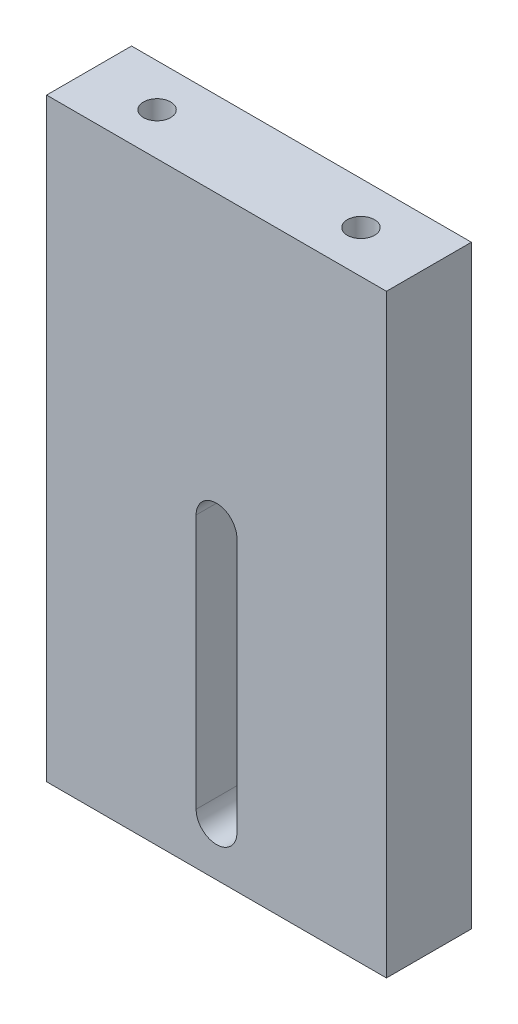
ISO-10303-21;
HEADER;
FILE_DESCRIPTION(('STEP AP214'),'2;1');
FILE_NAME('part.step','',(''),(''),'','','');
FILE_SCHEMA(('AUTOMOTIVE_DESIGN { 1 0 10303 214 1 1 1 1 }'));
ENDSEC;
DATA;
#1=APPLICATION_CONTEXT('core data for automotive mechanical design processes');
#2=APPLICATION_PROTOCOL_DEFINITION('international standard','automotive_design',2000,#1);
#3=PRODUCT_CONTEXT('',#1,'mechanical');
#4=PRODUCT('Part','Part','',(#3));
#5=PRODUCT_RELATED_PRODUCT_CATEGORY('part','',(#4));
#6=PRODUCT_DEFINITION_FORMATION('','',#4);
#7=PRODUCT_DEFINITION_CONTEXT('part definition',#1,'design');
#8=PRODUCT_DEFINITION('design','',#6,#7);
#9=PRODUCT_DEFINITION_SHAPE('','',#8);
#10=(LENGTH_UNIT() NAMED_UNIT(*) SI_UNIT(.MILLI.,.METRE.));
#11=(NAMED_UNIT(*) PLANE_ANGLE_UNIT() SI_UNIT($,.RADIAN.));
#12=(NAMED_UNIT(*) SI_UNIT($,.STERADIAN.) SOLID_ANGLE_UNIT());
#13=UNCERTAINTY_MEASURE_WITH_UNIT(LENGTH_MEASURE(1.E-05),#10,'distance_accuracy_value','');
#14=(GEOMETRIC_REPRESENTATION_CONTEXT(3) GLOBAL_UNCERTAINTY_ASSIGNED_CONTEXT((#13)) GLOBAL_UNIT_ASSIGNED_CONTEXT((#10,
#11,#12)) REPRESENTATION_CONTEXT('',''));
#15=CARTESIAN_POINT('',(0.,0.,0.));
#16=DIRECTION('',(0.,0.,1.));
#17=DIRECTION('',(1.,0.,0.));
#18=AXIS2_PLACEMENT_3D('',#15,#16,#17);
#19=CARTESIAN_POINT('',(10.,17.5,2.5));
#20=DIRECTION('',(-1.,0.,0.));
#21=DIRECTION('',(0.,-1.,0.));
#22=AXIS2_PLACEMENT_3D('',#19,#20,#21);
#23=PLANE('',#22);
#24=DIRECTION('',(0.,1.,0.));
#25=VECTOR('',#24,1.);
#26=CARTESIAN_POINT('',(10.,17.5,-2.5));
#27=LINE('',#26,#25);
#28=CARTESIAN_POINT('',(10.,-17.5,-2.5));
#29=VERTEX_POINT('',#28);
#30=CARTESIAN_POINT('',(10.,17.5,-2.5));
#31=VERTEX_POINT('',#30);
#32=EDGE_CURVE('E134',#29,#31,#27,.T.);
#33=ORIENTED_EDGE('',*,*,#32,.T.);
#34=DIRECTION('',(0.,0.,-1.));
#35=VECTOR('',#34,1.);
#36=CARTESIAN_POINT('',(10.,17.5,2.5));
#37=LINE('',#36,#35);
#38=CARTESIAN_POINT('',(10.,17.5,2.5));
#39=VERTEX_POINT('',#38);
#40=EDGE_CURVE('E11',#39,#31,#37,.T.);
#41=ORIENTED_EDGE('',*,*,#40,.F.);
#42=DIRECTION('',(0.,1.,0.));
#43=VECTOR('',#42,1.);
#44=CARTESIAN_POINT('',(10.,17.5,2.5));
#45=LINE('',#44,#43);
#46=CARTESIAN_POINT('',(10.,-17.5,2.5));
#47=VERTEX_POINT('',#46);
#48=EDGE_CURVE('E135',#47,#39,#45,.T.);
#49=ORIENTED_EDGE('',*,*,#48,.F.);
#50=DIRECTION('',(0.,0.,-1.));
#51=VECTOR('',#50,1.);
#52=CARTESIAN_POINT('',(10.,-17.5,2.5));
#53=LINE('',#52,#51);
#54=EDGE_CURVE('E145',#47,#29,#53,.T.);
#55=ORIENTED_EDGE('',*,*,#54,.T.);
#56=EDGE_LOOP('',(#33,#41,#49,#55));
#57=FACE_BOUND('',#56,.T.);
#58=ADVANCED_FACE('F17',(#57),#23,.F.);
#59=CARTESIAN_POINT('',(-10.,17.5,2.5));
#60=DIRECTION('',(0.,-1.,0.));
#61=DIRECTION('',(0.,0.,-1.));
#62=AXIS2_PLACEMENT_3D('',#59,#60,#61);
#63=PLANE('',#62);
#64=CARTESIAN_POINT('',(-6.,17.5,0.));
#65=DIRECTION('',(0.,1.,0.));
#66=DIRECTION('',(0.,0.,1.));
#67=AXIS2_PLACEMENT_3D('',#64,#65,#66);
#68=CIRCLE('',#67,0.79999999999999);
#69=CARTESIAN_POINT('',(-6.,17.5,0.79999999999999));
#70=VERTEX_POINT('',#69);
#71=EDGE_CURVE('E95',#70,#70,#68,.T.);
#72=ORIENTED_EDGE('',*,*,#71,.F.);
#73=EDGE_LOOP('',(#72));
#74=FACE_BOUND('',#73,.T.);
#75=CARTESIAN_POINT('',(6.,17.5,0.));
#76=DIRECTION('',(0.,1.,0.));
#77=DIRECTION('',(0.,0.,1.));
#78=AXIS2_PLACEMENT_3D('',#75,#76,#77);
#79=CIRCLE('',#78,0.79999999999999);
#80=CARTESIAN_POINT('',(6.,17.5,0.79999999999999));
#81=VERTEX_POINT('',#80);
#82=EDGE_CURVE('E128',#81,#81,#79,.T.);
#83=ORIENTED_EDGE('',*,*,#82,.F.);
#84=EDGE_LOOP('',(#83));
#85=FACE_BOUND('',#84,.T.);
#86=DIRECTION('',(-1.,0.,0.));
#87=VECTOR('',#86,1.);
#88=CARTESIAN_POINT('',(-10.,17.5,-2.5));
#89=LINE('',#88,#87);
#90=CARTESIAN_POINT('',(-10.,17.5,-2.5));
#91=VERTEX_POINT('',#90);
#92=EDGE_CURVE('E148',#31,#91,#89,.T.);
#93=ORIENTED_EDGE('',*,*,#92,.T.);
#94=DIRECTION('',(0.,0.,-1.));
#95=VECTOR('',#94,1.);
#96=CARTESIAN_POINT('',(-10.,17.5,2.5));
#97=LINE('',#96,#95);
#98=CARTESIAN_POINT('',(-10.,17.5,2.5));
#99=VERTEX_POINT('',#98);
#100=EDGE_CURVE('E24',#99,#91,#97,.T.);
#101=ORIENTED_EDGE('',*,*,#100,.F.);
#102=DIRECTION('',(-1.,0.,0.));
#103=VECTOR('',#102,1.);
#104=CARTESIAN_POINT('',(-10.,17.5,2.5));
#105=LINE('',#104,#103);
#106=EDGE_CURVE('E138',#39,#99,#105,.T.);
#107=ORIENTED_EDGE('',*,*,#106,.F.);
#108=ORIENTED_EDGE('',*,*,#40,.T.);
#109=EDGE_LOOP('',(#93,#101,#107,#108));
#110=FACE_BOUND('',#109,.T.);
#111=ADVANCED_FACE('F176',(#74,#85,#110),#63,.F.);
#112=CARTESIAN_POINT('',(-10.,17.5,2.5));
#113=DIRECTION('',(1.,0.,0.));
#114=DIRECTION('',(0.,1.,0.));
#115=AXIS2_PLACEMENT_3D('',#112,#113,#114);
#116=PLANE('',#115);
#117=DIRECTION('',(0.,-1.,0.));
#118=VECTOR('',#117,1.);
#119=CARTESIAN_POINT('',(-10.,17.5,-2.5));
#120=LINE('',#119,#118);
#121=CARTESIAN_POINT('',(-10.,-17.5,-2.5));
#122=VERTEX_POINT('',#121);
#123=EDGE_CURVE('E150',#91,#122,#120,.T.);
#124=ORIENTED_EDGE('',*,*,#123,.T.);
#125=DIRECTION('',(0.,0.,-1.));
#126=VECTOR('',#125,1.);
#127=CARTESIAN_POINT('',(-10.,-17.5,2.5));
#128=LINE('',#127,#126);
#129=CARTESIAN_POINT('',(-10.,-17.5,2.5));
#130=VERTEX_POINT('',#129);
#131=EDGE_CURVE('E155',#130,#122,#128,.T.);
#132=ORIENTED_EDGE('',*,*,#131,.F.);
#133=DIRECTION('',(0.,-1.,0.));
#134=VECTOR('',#133,1.);
#135=CARTESIAN_POINT('',(-10.,17.5,2.5));
#136=LINE('',#135,#134);
#137=EDGE_CURVE('E141',#99,#130,#136,.T.);
#138=ORIENTED_EDGE('',*,*,#137,.F.);
#139=ORIENTED_EDGE('',*,*,#100,.T.);
#140=EDGE_LOOP('',(#124,#132,#138,#139));
#141=FACE_BOUND('',#140,.T.);
#142=ADVANCED_FACE('F162',(#141),#116,.F.);
#143=CARTESIAN_POINT('',(-10.,-17.5,2.5));
#144=DIRECTION('',(0.,1.,0.));
#145=DIRECTION('',(0.,0.,1.));
#146=AXIS2_PLACEMENT_3D('',#143,#144,#145);
#147=PLANE('',#146);
#148=DIRECTION('',(1.,0.,0.));
#149=VECTOR('',#148,1.);
#150=CARTESIAN_POINT('',(-10.,-17.5,-2.5));
#151=LINE('',#150,#149);
#152=EDGE_CURVE('E139',#122,#29,#151,.T.);
#153=ORIENTED_EDGE('',*,*,#152,.T.);
#154=ORIENTED_EDGE('',*,*,#54,.F.);
#155=DIRECTION('',(1.,0.,0.));
#156=VECTOR('',#155,1.);
#157=CARTESIAN_POINT('',(-10.,-17.5,2.5));
#158=LINE('',#157,#156);
#159=EDGE_CURVE('E143',#130,#47,#158,.T.);
#160=ORIENTED_EDGE('',*,*,#159,.F.);
#161=ORIENTED_EDGE('',*,*,#131,.T.);
#162=EDGE_LOOP('',(#153,#154,#160,#161));
#163=FACE_BOUND('',#162,.T.);
#164=ADVANCED_FACE('F171',(#163),#147,.F.);
#165=CARTESIAN_POINT('',(0.,0.,2.5));
#166=DIRECTION('',(0.,0.,1.));
#167=DIRECTION('',(1.,0.,0.));
#168=AXIS2_PLACEMENT_3D('',#165,#166,#167);
#169=PLANE('',#168);
#170=CARTESIAN_POINT('',(0.,0.5,2.5));
#171=DIRECTION('',(0.,0.,1.));
#172=DIRECTION('',(1.,0.,0.));
#173=AXIS2_PLACEMENT_3D('',#170,#171,#172);
#174=CIRCLE('',#173,1.2);
#175=CARTESIAN_POINT('',(1.20000000000006,0.5,2.5));
#176=VERTEX_POINT('',#175);
#177=CARTESIAN_POINT('',(-1.2,0.5,2.5));
#178=VERTEX_POINT('',#177);
#179=EDGE_CURVE('E100',#176,#178,#174,.T.);
#180=ORIENTED_EDGE('',*,*,#179,.F.);
#181=DIRECTION('',(0.,1.,0.));
#182=VECTOR('',#181,1.);
#183=CARTESIAN_POINT('',(1.20000000000006,-14.5,2.5));
#184=LINE('',#183,#182);
#185=CARTESIAN_POINT('',(1.2,-14.5,2.5));
#186=VERTEX_POINT('',#185);
#187=EDGE_CURVE('E226',#186,#176,#184,.T.);
#188=ORIENTED_EDGE('',*,*,#187,.F.);
#189=CARTESIAN_POINT('',(0.,-14.5,2.5));
#190=DIRECTION('',(0.,0.,1.));
#191=DIRECTION('',(1.,0.,0.));
#192=AXIS2_PLACEMENT_3D('',#189,#190,#191);
#193=CIRCLE('',#192,1.2);
#194=CARTESIAN_POINT('',(-1.2,-14.5,2.5));
#195=VERTEX_POINT('',#194);
#196=EDGE_CURVE('E109',#195,#186,#193,.T.);
#197=ORIENTED_EDGE('',*,*,#196,.F.);
#198=DIRECTION('',(0.,1.,0.));
#199=VECTOR('',#198,1.);
#200=CARTESIAN_POINT('',(-1.2,-14.5,2.5));
#201=LINE('',#200,#199);
#202=EDGE_CURVE('E89',#195,#178,#201,.T.);
#203=ORIENTED_EDGE('',*,*,#202,.T.);
#204=EDGE_LOOP('',(#180,#188,#197,#203));
#205=FACE_BOUND('',#204,.T.);
#206=ORIENTED_EDGE('',*,*,#48,.T.);
#207=ORIENTED_EDGE('',*,*,#106,.T.);
#208=ORIENTED_EDGE('',*,*,#137,.T.);
#209=ORIENTED_EDGE('',*,*,#159,.T.);
#210=EDGE_LOOP('',(#206,#207,#208,#209));
#211=FACE_BOUND('',#210,.T.);
#212=ADVANCED_FACE('F107',(#205,#211),#169,.T.);
#213=CARTESIAN_POINT('',(0.,0.,-2.5));
#214=DIRECTION('',(0.,0.,1.));
#215=DIRECTION('',(1.,0.,0.));
#216=AXIS2_PLACEMENT_3D('',#213,#214,#215);
#217=PLANE('',#216);
#218=DIRECTION('',(0.,1.,0.));
#219=VECTOR('',#218,1.);
#220=CARTESIAN_POINT('',(1.2,-14.5,-2.5));
#221=LINE('',#220,#219);
#222=CARTESIAN_POINT('',(1.2,-14.5,-2.5));
#223=VERTEX_POINT('',#222);
#224=CARTESIAN_POINT('',(1.2,0.5,-2.5));
#225=VERTEX_POINT('',#224);
#226=EDGE_CURVE('E112',#223,#225,#221,.T.);
#227=ORIENTED_EDGE('',*,*,#226,.T.);
#228=CARTESIAN_POINT('',(0.,0.5,-2.5));
#229=DIRECTION('',(0.,0.,1.));
#230=DIRECTION('',(1.,0.,0.));
#231=AXIS2_PLACEMENT_3D('',#228,#229,#230);
#232=CIRCLE('',#231,1.2);
#233=CARTESIAN_POINT('',(-1.2,0.5,-2.5));
#234=VERTEX_POINT('',#233);
#235=EDGE_CURVE('E96',#225,#234,#232,.T.);
#236=ORIENTED_EDGE('',*,*,#235,.T.);
#237=DIRECTION('',(0.,1.,0.));
#238=VECTOR('',#237,1.);
#239=CARTESIAN_POINT('',(-1.2,-14.5,-2.5));
#240=LINE('',#239,#238);
#241=CARTESIAN_POINT('',(-1.2,-14.5,-2.5));
#242=VERTEX_POINT('',#241);
#243=EDGE_CURVE('E92',#242,#234,#240,.T.);
#244=ORIENTED_EDGE('',*,*,#243,.F.);
#245=CARTESIAN_POINT('',(0.,-14.5,-2.5));
#246=DIRECTION('',(0.,0.,1.));
#247=DIRECTION('',(1.,0.,0.));
#248=AXIS2_PLACEMENT_3D('',#245,#246,#247);
#249=CIRCLE('',#248,1.2);
#250=EDGE_CURVE('E117',#242,#223,#249,.T.);
#251=ORIENTED_EDGE('',*,*,#250,.T.);
#252=EDGE_LOOP('',(#227,#236,#244,#251));
#253=FACE_BOUND('',#252,.T.);
#254=ORIENTED_EDGE('',*,*,#32,.F.);
#255=ORIENTED_EDGE('',*,*,#152,.F.);
#256=ORIENTED_EDGE('',*,*,#123,.F.);
#257=ORIENTED_EDGE('',*,*,#92,.F.);
#258=EDGE_LOOP('',(#254,#255,#256,#257));
#259=FACE_BOUND('',#258,.T.);
#260=ADVANCED_FACE('F168',(#253,#259),#217,.F.);
#261=CARTESIAN_POINT('',(6.,12.3,0.));
#262=DIRECTION('',(0.,1.,0.));
#263=DIRECTION('',(0.,0.,1.));
#264=AXIS2_PLACEMENT_3D('',#261,#262,#263);
#265=CONICAL_SURFACE('',#264,0.8,1.02974425867665);
#266=CARTESIAN_POINT('',(6.,11.8193115047779,0.));
#267=VERTEX_POINT('',#266);
#268=VERTEX_LOOP('',#267);
#269=FACE_BOUND('',#268,.T.);
#270=CARTESIAN_POINT('',(6.,12.3,0.));
#271=DIRECTION('',(0.,1.,0.));
#272=DIRECTION('',(0.,0.,1.));
#273=AXIS2_PLACEMENT_3D('',#270,#271,#272);
#274=CIRCLE('',#273,0.8);
#275=CARTESIAN_POINT('',(6.,12.3,0.8));
#276=VERTEX_POINT('',#275);
#277=EDGE_CURVE('E131',#276,#276,#274,.T.);
#278=ORIENTED_EDGE('',*,*,#277,.T.);
#279=EDGE_LOOP('',(#278));
#280=FACE_BOUND('',#279,.T.);
#281=ADVANCED_FACE('F193',(#269,#280),#265,.F.);
#282=CARTESIAN_POINT('',(6.,17.5,0.));
#283=DIRECTION('',(0.,1.,0.));
#284=DIRECTION('',(0.,0.,1.));
#285=AXIS2_PLACEMENT_3D('',#282,#283,#284);
#286=CYLINDRICAL_SURFACE('',#285,0.8);
#287=ORIENTED_EDGE('',*,*,#277,.F.);
#288=EDGE_LOOP('',(#287));
#289=FACE_BOUND('',#288,.T.);
#290=ORIENTED_EDGE('',*,*,#82,.T.);
#291=EDGE_LOOP('',(#290));
#292=FACE_BOUND('',#291,.T.);
#293=ADVANCED_FACE('F199',(#289,#292),#286,.F.);
#294=CARTESIAN_POINT('',(-6.,12.3,0.));
#295=DIRECTION('',(0.,1.,0.));
#296=DIRECTION('',(0.,0.,1.));
#297=AXIS2_PLACEMENT_3D('',#294,#295,#296);
#298=CONICAL_SURFACE('',#297,0.8,1.02974425867665);
#299=CARTESIAN_POINT('',(-6.,11.8193115047779,0.));
#300=VERTEX_POINT('',#299);
#301=VERTEX_LOOP('',#300);
#302=FACE_BOUND('',#301,.T.);
#303=CARTESIAN_POINT('',(-6.,12.3,0.));
#304=DIRECTION('',(0.,1.,0.));
#305=DIRECTION('',(0.,0.,1.));
#306=AXIS2_PLACEMENT_3D('',#303,#304,#305);
#307=CIRCLE('',#306,0.8);
#308=CARTESIAN_POINT('',(-6.,12.3,0.8));
#309=VERTEX_POINT('',#308);
#310=EDGE_CURVE('E125',#309,#309,#307,.T.);
#311=ORIENTED_EDGE('',*,*,#310,.T.);
#312=EDGE_LOOP('',(#311));
#313=FACE_BOUND('',#312,.T.);
#314=ADVANCED_FACE('F203',(#302,#313),#298,.F.);
#315=CARTESIAN_POINT('',(-6.,17.5,0.));
#316=DIRECTION('',(0.,1.,0.));
#317=DIRECTION('',(0.,0.,1.));
#318=AXIS2_PLACEMENT_3D('',#315,#316,#317);
#319=CYLINDRICAL_SURFACE('',#318,0.8);
#320=ORIENTED_EDGE('',*,*,#310,.F.);
#321=EDGE_LOOP('',(#320));
#322=FACE_BOUND('',#321,.T.);
#323=ORIENTED_EDGE('',*,*,#71,.T.);
#324=EDGE_LOOP('',(#323));
#325=FACE_BOUND('',#324,.T.);
#326=ADVANCED_FACE('F207',(#322,#325),#319,.F.);
#327=CARTESIAN_POINT('',(0.,0.5,2.5));
#328=DIRECTION('',(0.,0.,1.));
#329=DIRECTION('',(1.,0.,0.));
#330=AXIS2_PLACEMENT_3D('',#327,#328,#329);
#331=CYLINDRICAL_SURFACE('',#330,1.2);
#332=ORIENTED_EDGE('',*,*,#235,.F.);
#333=DIRECTION('',(0.,0.,-1.));
#334=VECTOR('',#333,1.);
#335=CARTESIAN_POINT('',(1.2,0.5,-2.5));
#336=LINE('',#335,#334);
#337=EDGE_CURVE('E103',#176,#225,#336,.T.);
#338=ORIENTED_EDGE('',*,*,#337,.F.);
#339=ORIENTED_EDGE('',*,*,#179,.T.);
#340=DIRECTION('',(0.,0.,1.));
#341=VECTOR('',#340,1.);
#342=CARTESIAN_POINT('',(-1.2,0.5,2.5));
#343=LINE('',#342,#341);
#344=EDGE_CURVE('E85',#234,#178,#343,.T.);
#345=ORIENTED_EDGE('',*,*,#344,.F.);
#346=EDGE_LOOP('',(#332,#338,#339,#345));
#347=FACE_BOUND('',#346,.T.);
#348=ADVANCED_FACE('F101',(#347),#331,.F.);
#349=CARTESIAN_POINT('',(0.,-14.5,2.5));
#350=DIRECTION('',(0.,0.,1.));
#351=DIRECTION('',(1.,0.,0.));
#352=AXIS2_PLACEMENT_3D('',#349,#350,#351);
#353=CYLINDRICAL_SURFACE('',#352,1.2);
#354=ORIENTED_EDGE('',*,*,#196,.T.);
#355=DIRECTION('',(0.,0.,-1.));
#356=VECTOR('',#355,1.);
#357=CARTESIAN_POINT('',(1.2,-14.5,-2.5));
#358=LINE('',#357,#356);
#359=EDGE_CURVE('E36',#186,#223,#358,.T.);
#360=ORIENTED_EDGE('',*,*,#359,.T.);
#361=ORIENTED_EDGE('',*,*,#250,.F.);
#362=DIRECTION('',(0.,0.,1.));
#363=VECTOR('',#362,1.);
#364=CARTESIAN_POINT('',(-1.2,-14.5,2.5));
#365=LINE('',#364,#363);
#366=EDGE_CURVE('E31',#195,#242,#365,.F.);
#367=ORIENTED_EDGE('',*,*,#366,.F.);
#368=EDGE_LOOP('',(#354,#360,#361,#367));
#369=FACE_BOUND('',#368,.T.);
#370=ADVANCED_FACE('F214',(#369),#353,.F.);
#371=CARTESIAN_POINT('',(-1.2,-14.5,2.5));
#372=DIRECTION('',(-1.,0.,0.));
#373=DIRECTION('',(0.,-1.,0.));
#374=AXIS2_PLACEMENT_3D('',#371,#372,#373);
#375=PLANE('',#374);
#376=ORIENTED_EDGE('',*,*,#344,.T.);
#377=ORIENTED_EDGE('',*,*,#202,.F.);
#378=ORIENTED_EDGE('',*,*,#366,.T.);
#379=ORIENTED_EDGE('',*,*,#243,.T.);
#380=EDGE_LOOP('',(#376,#377,#378,#379));
#381=FACE_BOUND('',#380,.T.);
#382=ADVANCED_FACE('F87',(#381),#375,.F.);
#383=CARTESIAN_POINT('',(1.2,-14.5,-2.5));
#384=DIRECTION('',(1.,0.,0.));
#385=DIRECTION('',(0.,0.,-1.));
#386=AXIS2_PLACEMENT_3D('',#383,#384,#385);
#387=PLANE('',#386);
#388=ORIENTED_EDGE('',*,*,#337,.T.);
#389=ORIENTED_EDGE('',*,*,#226,.F.);
#390=ORIENTED_EDGE('',*,*,#359,.F.);
#391=ORIENTED_EDGE('',*,*,#187,.T.);
#392=EDGE_LOOP('',(#388,#389,#390,#391));
#393=FACE_BOUND('',#392,.T.);
#394=ADVANCED_FACE('F219',(#393),#387,.F.);
#395=CLOSED_SHELL('',(#58,#111,#142,#164,#212,#260,#281,#293,#314,#326,#348,#370,#382,#394));
#396=MANIFOLD_SOLID_BREP('B1',#395);
#397=ADVANCED_BREP_SHAPE_REPRESENTATION('',(#18,#396),#14);
#398=SHAPE_DEFINITION_REPRESENTATION(#9,#397);
ENDSEC;
END-ISO-10303-21;
